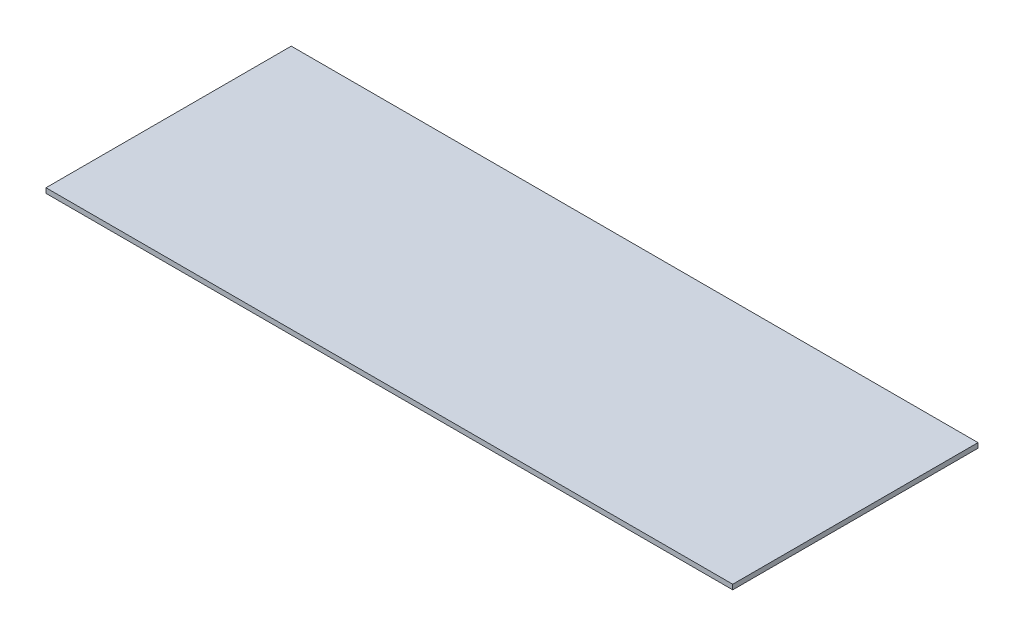
ISO-10303-21;
HEADER;
FILE_DESCRIPTION(('STEP AP214'),'2;1');
FILE_NAME('part.step','',(''),(''),'','','');
FILE_SCHEMA(('AUTOMOTIVE_DESIGN { 1 0 10303 214 1 1 1 1 }'));
ENDSEC;
DATA;
#1=APPLICATION_CONTEXT('core data for automotive mechanical design processes');
#2=APPLICATION_PROTOCOL_DEFINITION('international standard','automotive_design',2000,#1);
#3=PRODUCT_CONTEXT('',#1,'mechanical');
#4=PRODUCT('Part','Part','',(#3));
#5=PRODUCT_RELATED_PRODUCT_CATEGORY('part','',(#4));
#6=PRODUCT_DEFINITION_FORMATION('','',#4);
#7=PRODUCT_DEFINITION_CONTEXT('part definition',#1,'design');
#8=PRODUCT_DEFINITION('design','',#6,#7);
#9=PRODUCT_DEFINITION_SHAPE('','',#8);
#10=(LENGTH_UNIT() NAMED_UNIT(*) SI_UNIT(.MILLI.,.METRE.));
#11=(NAMED_UNIT(*) PLANE_ANGLE_UNIT() SI_UNIT($,.RADIAN.));
#12=(NAMED_UNIT(*) SI_UNIT($,.STERADIAN.) SOLID_ANGLE_UNIT());
#13=UNCERTAINTY_MEASURE_WITH_UNIT(LENGTH_MEASURE(1.E-05),#10,'distance_accuracy_value','');
#14=(GEOMETRIC_REPRESENTATION_CONTEXT(3) GLOBAL_UNCERTAINTY_ASSIGNED_CONTEXT((#13)) GLOBAL_UNIT_ASSIGNED_CONTEXT((#10,
#11,#12)) REPRESENTATION_CONTEXT('',''));
#15=CARTESIAN_POINT('',(0.,0.,0.));
#16=DIRECTION('',(0.,0.,1.));
#17=DIRECTION('',(1.,0.,0.));
#18=AXIS2_PLACEMENT_3D('',#15,#16,#17);
#19=CARTESIAN_POINT('',(700.,10.,-250.));
#20=DIRECTION('',(-1.,0.,0.));
#21=DIRECTION('',(0.,0.,1.));
#22=AXIS2_PLACEMENT_3D('',#19,#20,#21);
#23=PLANE('',#22);
#24=DIRECTION('',(0.,0.,-1.));
#25=VECTOR('',#24,1.);
#26=CARTESIAN_POINT('',(700.,0.,-250.));
#27=LINE('',#26,#25);
#28=CARTESIAN_POINT('',(700.,0.,250.));
#29=VERTEX_POINT('',#28);
#30=CARTESIAN_POINT('',(700.,0.,-250.));
#31=VERTEX_POINT('',#30);
#32=EDGE_CURVE('E106',#29,#31,#27,.T.);
#33=ORIENTED_EDGE('',*,*,#32,.T.);
#34=DIRECTION('',(0.,-1.,0.));
#35=VECTOR('',#34,1.);
#36=CARTESIAN_POINT('',(700.,10.,-250.));
#37=LINE('',#36,#35);
#38=CARTESIAN_POINT('',(700.,10.,-250.));
#39=VERTEX_POINT('',#38);
#40=EDGE_CURVE('E11',#39,#31,#37,.T.);
#41=ORIENTED_EDGE('',*,*,#40,.F.);
#42=DIRECTION('',(0.,0.,-1.));
#43=VECTOR('',#42,1.);
#44=CARTESIAN_POINT('',(700.,10.,-250.));
#45=LINE('',#44,#43);
#46=CARTESIAN_POINT('',(700.,10.,250.));
#47=VERTEX_POINT('',#46);
#48=EDGE_CURVE('E94',#47,#39,#45,.T.);
#49=ORIENTED_EDGE('',*,*,#48,.F.);
#50=DIRECTION('',(0.,-1.,0.));
#51=VECTOR('',#50,1.);
#52=CARTESIAN_POINT('',(700.,10.,250.));
#53=LINE('',#52,#51);
#54=EDGE_CURVE('E102',#47,#29,#53,.T.);
#55=ORIENTED_EDGE('',*,*,#54,.T.);
#56=EDGE_LOOP('',(#33,#41,#49,#55));
#57=FACE_BOUND('',#56,.T.);
#58=ADVANCED_FACE('F43',(#57),#23,.F.);
#59=CARTESIAN_POINT('',(-700.,10.,-250.));
#60=DIRECTION('',(0.,0.,1.));
#61=DIRECTION('',(1.,0.,0.));
#62=AXIS2_PLACEMENT_3D('',#59,#60,#61);
#63=PLANE('',#62);
#64=DIRECTION('',(-1.,0.,0.));
#65=VECTOR('',#64,1.);
#66=CARTESIAN_POINT('',(-700.,0.,-250.));
#67=LINE('',#66,#65);
#68=CARTESIAN_POINT('',(-700.,0.,-250.));
#69=VERTEX_POINT('',#68);
#70=EDGE_CURVE('E98',#31,#69,#67,.T.);
#71=ORIENTED_EDGE('',*,*,#70,.T.);
#72=DIRECTION('',(0.,-1.,0.));
#73=VECTOR('',#72,1.);
#74=CARTESIAN_POINT('',(-700.,10.,-250.));
#75=LINE('',#74,#73);
#76=CARTESIAN_POINT('',(-700.,10.,-250.));
#77=VERTEX_POINT('',#76);
#78=EDGE_CURVE('E51',#77,#69,#75,.T.);
#79=ORIENTED_EDGE('',*,*,#78,.F.);
#80=DIRECTION('',(-1.,0.,0.));
#81=VECTOR('',#80,1.);
#82=CARTESIAN_POINT('',(-700.,10.,-250.));
#83=LINE('',#82,#81);
#84=EDGE_CURVE('E89',#39,#77,#83,.T.);
#85=ORIENTED_EDGE('',*,*,#84,.F.);
#86=ORIENTED_EDGE('',*,*,#40,.T.);
#87=EDGE_LOOP('',(#71,#79,#85,#86));
#88=FACE_BOUND('',#87,.T.);
#89=ADVANCED_FACE('F97',(#88),#63,.F.);
#90=CARTESIAN_POINT('',(-700.,10.,-250.));
#91=DIRECTION('',(1.,0.,0.));
#92=DIRECTION('',(0.,0.,-1.));
#93=AXIS2_PLACEMENT_3D('',#90,#91,#92);
#94=PLANE('',#93);
#95=DIRECTION('',(0.,0.,1.));
#96=VECTOR('',#95,1.);
#97=CARTESIAN_POINT('',(-700.,0.,-250.));
#98=LINE('',#97,#96);
#99=CARTESIAN_POINT('',(-700.,0.,250.));
#100=VERTEX_POINT('',#99);
#101=EDGE_CURVE('E76',#69,#100,#98,.T.);
#102=ORIENTED_EDGE('',*,*,#101,.T.);
#103=DIRECTION('',(0.,-1.,0.));
#104=VECTOR('',#103,1.);
#105=CARTESIAN_POINT('',(-700.,10.,250.));
#106=LINE('',#105,#104);
#107=CARTESIAN_POINT('',(-700.,10.,250.));
#108=VERTEX_POINT('',#107);
#109=EDGE_CURVE('E99',#108,#100,#106,.T.);
#110=ORIENTED_EDGE('',*,*,#109,.F.);
#111=DIRECTION('',(0.,0.,1.));
#112=VECTOR('',#111,1.);
#113=CARTESIAN_POINT('',(-700.,10.,-250.));
#114=LINE('',#113,#112);
#115=EDGE_CURVE('E92',#77,#108,#114,.T.);
#116=ORIENTED_EDGE('',*,*,#115,.F.);
#117=ORIENTED_EDGE('',*,*,#78,.T.);
#118=EDGE_LOOP('',(#102,#110,#116,#117));
#119=FACE_BOUND('',#118,.T.);
#120=ADVANCED_FACE('F100',(#119),#94,.F.);
#121=CARTESIAN_POINT('',(-700.,10.,250.));
#122=DIRECTION('',(0.,0.,-1.));
#123=DIRECTION('',(-1.,0.,0.));
#124=AXIS2_PLACEMENT_3D('',#121,#122,#123);
#125=PLANE('',#124);
#126=DIRECTION('',(1.,0.,0.));
#127=VECTOR('',#126,1.);
#128=CARTESIAN_POINT('',(-700.,0.,250.));
#129=LINE('',#128,#127);
#130=EDGE_CURVE('E82',#100,#29,#129,.T.);
#131=ORIENTED_EDGE('',*,*,#130,.T.);
#132=ORIENTED_EDGE('',*,*,#54,.F.);
#133=DIRECTION('',(1.,0.,0.));
#134=VECTOR('',#133,1.);
#135=CARTESIAN_POINT('',(-700.,10.,250.));
#136=LINE('',#135,#134);
#137=EDGE_CURVE('E59',#108,#47,#136,.T.);
#138=ORIENTED_EDGE('',*,*,#137,.F.);
#139=ORIENTED_EDGE('',*,*,#109,.T.);
#140=EDGE_LOOP('',(#131,#132,#138,#139));
#141=FACE_BOUND('',#140,.T.);
#142=ADVANCED_FACE('F113',(#141),#125,.F.);
#143=CARTESIAN_POINT('',(0.,10.,0.));
#144=DIRECTION('',(0.,1.,0.));
#145=DIRECTION('',(0.,0.,1.));
#146=AXIS2_PLACEMENT_3D('',#143,#144,#145);
#147=PLANE('',#146);
#148=ORIENTED_EDGE('',*,*,#48,.T.);
#149=ORIENTED_EDGE('',*,*,#84,.T.);
#150=ORIENTED_EDGE('',*,*,#115,.T.);
#151=ORIENTED_EDGE('',*,*,#137,.T.);
#152=EDGE_LOOP('',(#148,#149,#150,#151));
#153=FACE_BOUND('',#152,.T.);
#154=ADVANCED_FACE('F90',(#153),#147,.T.);
#155=CARTESIAN_POINT('',(0.,0.,0.));
#156=DIRECTION('',(0.,1.,0.));
#157=DIRECTION('',(0.,0.,1.));
#158=AXIS2_PLACEMENT_3D('',#155,#156,#157);
#159=PLANE('',#158);
#160=ORIENTED_EDGE('',*,*,#32,.F.);
#161=ORIENTED_EDGE('',*,*,#130,.F.);
#162=ORIENTED_EDGE('',*,*,#101,.F.);
#163=ORIENTED_EDGE('',*,*,#70,.F.);
#164=EDGE_LOOP('',(#160,#161,#162,#163));
#165=FACE_BOUND('',#164,.T.);
#166=ADVANCED_FACE('F116',(#165),#159,.F.);
#167=CLOSED_SHELL('',(#58,#89,#120,#142,#154,#166));
#168=MANIFOLD_SOLID_BREP('B2',#167);
#169=ADVANCED_BREP_SHAPE_REPRESENTATION('',(#18,#168),#14);
#170=SHAPE_DEFINITION_REPRESENTATION(#9,#169);
ENDSEC;
END-ISO-10303-21;
